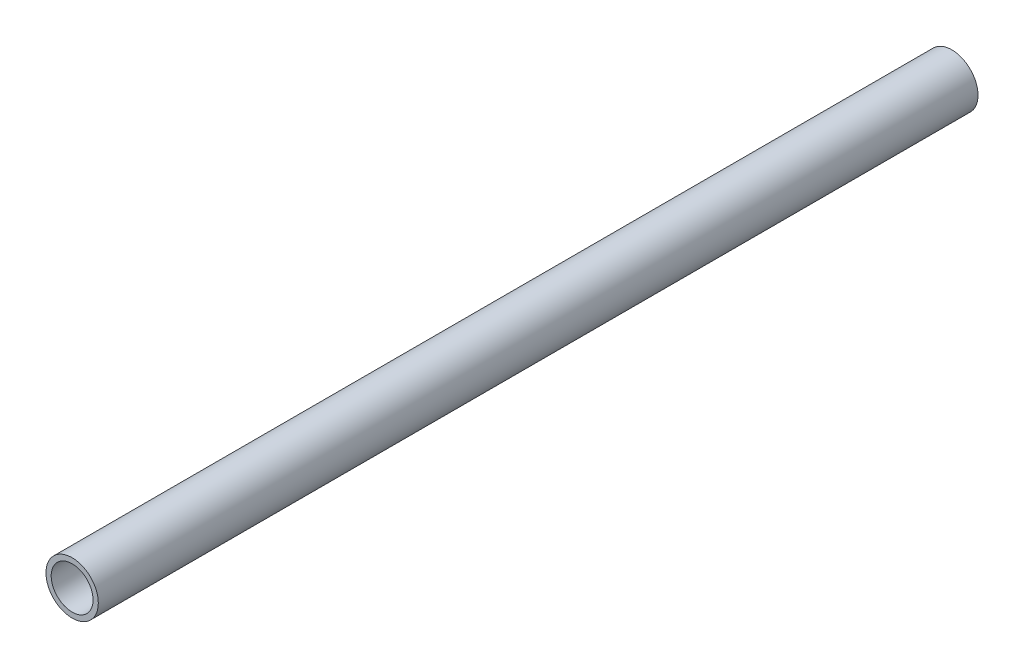
ISO-10303-21;
HEADER;
FILE_DESCRIPTION(('STEP AP214'),'2;1');
FILE_NAME('part.step','',(''),(''),'','','');
FILE_SCHEMA(('AUTOMOTIVE_DESIGN { 1 0 10303 214 1 1 1 1 }'));
ENDSEC;
DATA;
#1=APPLICATION_CONTEXT('core data for automotive mechanical design processes');
#2=APPLICATION_PROTOCOL_DEFINITION('international standard','automotive_design',2000,#1);
#3=PRODUCT_CONTEXT('',#1,'mechanical');
#4=PRODUCT('Part','Part','',(#3));
#5=PRODUCT_RELATED_PRODUCT_CATEGORY('part','',(#4));
#6=PRODUCT_DEFINITION_FORMATION('','',#4);
#7=PRODUCT_DEFINITION_CONTEXT('part definition',#1,'design');
#8=PRODUCT_DEFINITION('design','',#6,#7);
#9=PRODUCT_DEFINITION_SHAPE('','',#8);
#10=(LENGTH_UNIT() NAMED_UNIT(*) SI_UNIT(.MILLI.,.METRE.));
#11=(NAMED_UNIT(*) PLANE_ANGLE_UNIT() SI_UNIT($,.RADIAN.));
#12=(NAMED_UNIT(*) SI_UNIT($,.STERADIAN.) SOLID_ANGLE_UNIT());
#13=UNCERTAINTY_MEASURE_WITH_UNIT(LENGTH_MEASURE(1.E-05),#10,'distance_accuracy_value','');
#14=(GEOMETRIC_REPRESENTATION_CONTEXT(3) GLOBAL_UNCERTAINTY_ASSIGNED_CONTEXT((#13)) GLOBAL_UNIT_ASSIGNED_CONTEXT((#10,
#11,#12)) REPRESENTATION_CONTEXT('',''));
#15=CARTESIAN_POINT('',(0.,0.,0.));
#16=DIRECTION('',(0.,0.,1.));
#17=DIRECTION('',(1.,0.,0.));
#18=AXIS2_PLACEMENT_3D('',#15,#16,#17);
#19=CARTESIAN_POINT('',(0.,0.,533.4));
#20=DIRECTION('',(0.,0.,1.));
#21=DIRECTION('',(1.,0.,0.));
#22=AXIS2_PLACEMENT_3D('',#19,#20,#21);
#23=PLANE('',#22);
#24=CARTESIAN_POINT('',(0.,0.,533.4));
#25=DIRECTION('',(0.,0.,1.));
#26=DIRECTION('',(1.,0.,0.));
#27=AXIS2_PLACEMENT_3D('',#24,#25,#26);
#28=CIRCLE('',#27,15.875);
#29=CARTESIAN_POINT('',(15.875,0.,533.4));
#30=VERTEX_POINT('',#29);
#31=EDGE_CURVE('E10',#30,#30,#28,.T.);
#32=ORIENTED_EDGE('',*,*,#31,.T.);
#33=EDGE_LOOP('',(#32));
#34=FACE_BOUND('',#33,.T.);
#35=CARTESIAN_POINT('',(0.,0.,533.4));
#36=DIRECTION('',(0.,0.,1.));
#37=DIRECTION('',(1.,0.,0.));
#38=AXIS2_PLACEMENT_3D('',#35,#36,#37);
#39=CIRCLE('',#38,12.7);
#40=CARTESIAN_POINT('',(12.7,0.,533.4));
#41=VERTEX_POINT('',#40);
#42=EDGE_CURVE('E44',#41,#41,#39,.T.);
#43=ORIENTED_EDGE('',*,*,#42,.F.);
#44=EDGE_LOOP('',(#43));
#45=FACE_BOUND('',#44,.T.);
#46=ADVANCED_FACE('F33',(#34,#45),#23,.T.);
#47=CARTESIAN_POINT('',(0.,0.,0.));
#48=DIRECTION('',(0.,0.,1.));
#49=DIRECTION('',(1.,0.,0.));
#50=AXIS2_PLACEMENT_3D('',#47,#48,#49);
#51=PLANE('',#50);
#52=CARTESIAN_POINT('',(0.,0.,0.));
#53=DIRECTION('',(0.,0.,1.));
#54=DIRECTION('',(1.,0.,0.));
#55=AXIS2_PLACEMENT_3D('',#52,#53,#54);
#56=CIRCLE('',#55,15.875);
#57=CARTESIAN_POINT('',(15.875,0.,0.));
#58=VERTEX_POINT('',#57);
#59=EDGE_CURVE('E37',#58,#58,#56,.T.);
#60=ORIENTED_EDGE('',*,*,#59,.F.);
#61=EDGE_LOOP('',(#60));
#62=FACE_BOUND('',#61,.T.);
#63=CARTESIAN_POINT('',(0.,0.,0.));
#64=DIRECTION('',(0.,0.,1.));
#65=DIRECTION('',(1.,0.,0.));
#66=AXIS2_PLACEMENT_3D('',#63,#64,#65);
#67=CIRCLE('',#66,12.7);
#68=CARTESIAN_POINT('',(12.7,0.,0.));
#69=VERTEX_POINT('',#68);
#70=EDGE_CURVE('E46',#69,#69,#67,.T.);
#71=ORIENTED_EDGE('',*,*,#70,.T.);
#72=EDGE_LOOP('',(#71));
#73=FACE_BOUND('',#72,.T.);
#74=ADVANCED_FACE('F56',(#62,#73),#51,.F.);
#75=CARTESIAN_POINT('',(0.,0.,533.4));
#76=DIRECTION('',(0.,0.,-1.));
#77=DIRECTION('',(-1.,0.,0.));
#78=AXIS2_PLACEMENT_3D('',#75,#76,#77);
#79=CYLINDRICAL_SURFACE('',#78,15.875);
#80=ORIENTED_EDGE('',*,*,#31,.F.);
#81=EDGE_LOOP('',(#80));
#82=FACE_BOUND('',#81,.T.);
#83=ORIENTED_EDGE('',*,*,#59,.T.);
#84=EDGE_LOOP('',(#83));
#85=FACE_BOUND('',#84,.T.);
#86=ADVANCED_FACE('F35',(#82,#85),#79,.T.);
#87=CARTESIAN_POINT('',(0.,0.,533.4));
#88=DIRECTION('',(0.,0.,-1.));
#89=DIRECTION('',(-1.,0.,0.));
#90=AXIS2_PLACEMENT_3D('',#87,#88,#89);
#91=CYLINDRICAL_SURFACE('',#90,12.7);
#92=ORIENTED_EDGE('',*,*,#42,.T.);
#93=EDGE_LOOP('',(#92));
#94=FACE_BOUND('',#93,.T.);
#95=ORIENTED_EDGE('',*,*,#70,.F.);
#96=EDGE_LOOP('',(#95));
#97=FACE_BOUND('',#96,.T.);
#98=ADVANCED_FACE('F52',(#94,#97),#91,.F.);
#99=CLOSED_SHELL('',(#46,#74,#86,#98));
#100=MANIFOLD_SOLID_BREP('B2',#99);
#101=ADVANCED_BREP_SHAPE_REPRESENTATION('',(#18,#100),#14);
#102=SHAPE_DEFINITION_REPRESENTATION(#9,#101);
ENDSEC;
END-ISO-10303-21;
